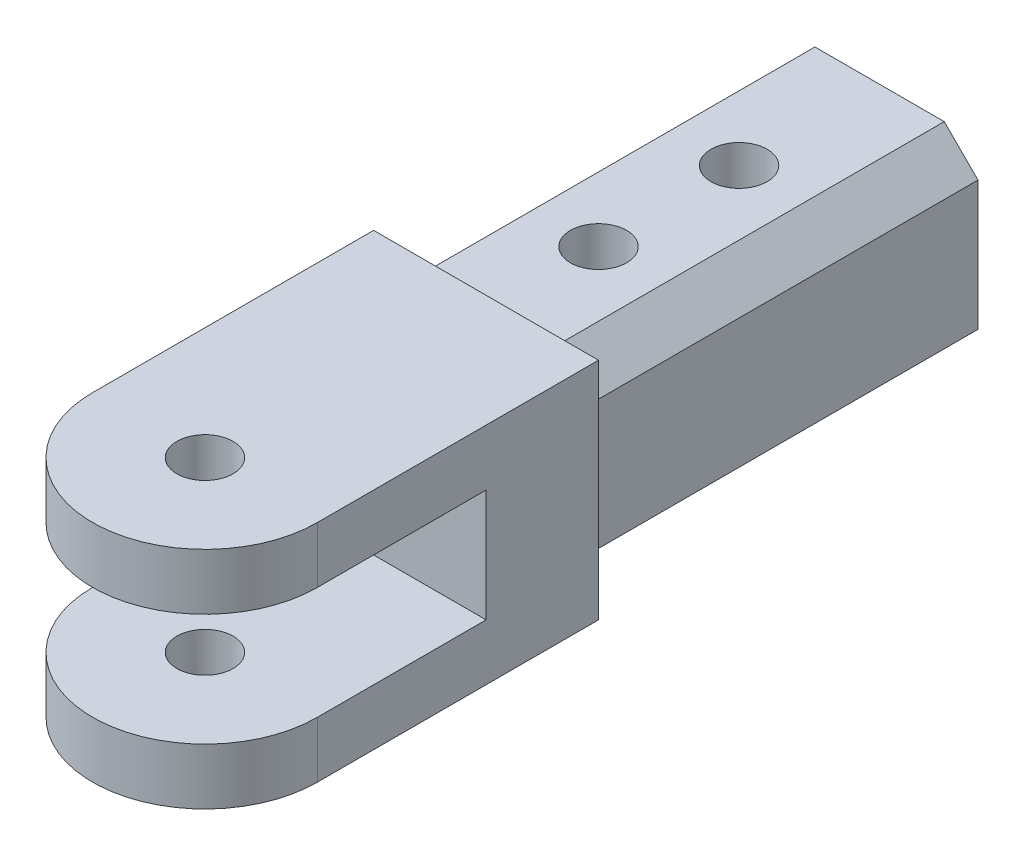
ISO-10303-21;
HEADER;
FILE_DESCRIPTION(('STEP AP214'),'2;1');
FILE_NAME('part.step','',(''),(''),'','','');
FILE_SCHEMA(('AUTOMOTIVE_DESIGN { 1 0 10303 214 1 1 1 1 }'));
ENDSEC;
DATA;
#1=APPLICATION_CONTEXT('core data for automotive mechanical design processes');
#2=APPLICATION_PROTOCOL_DEFINITION('international standard','automotive_design',2000,#1);
#3=PRODUCT_CONTEXT('',#1,'mechanical');
#4=PRODUCT('Part','Part','',(#3));
#5=PRODUCT_RELATED_PRODUCT_CATEGORY('part','',(#4));
#6=PRODUCT_DEFINITION_FORMATION('','',#4);
#7=PRODUCT_DEFINITION_CONTEXT('part definition',#1,'design');
#8=PRODUCT_DEFINITION('design','',#6,#7);
#9=PRODUCT_DEFINITION_SHAPE('','',#8);
#10=(LENGTH_UNIT() NAMED_UNIT(*) SI_UNIT(.MILLI.,.METRE.));
#11=(NAMED_UNIT(*) PLANE_ANGLE_UNIT() SI_UNIT($,.RADIAN.));
#12=(NAMED_UNIT(*) SI_UNIT($,.STERADIAN.) SOLID_ANGLE_UNIT());
#13=UNCERTAINTY_MEASURE_WITH_UNIT(LENGTH_MEASURE(1.E-05),#10,'distance_accuracy_value','');
#14=(GEOMETRIC_REPRESENTATION_CONTEXT(3) GLOBAL_UNCERTAINTY_ASSIGNED_CONTEXT((#13)) GLOBAL_UNIT_ASSIGNED_CONTEXT((#10,
#11,#12)) REPRESENTATION_CONTEXT('',''));
#15=CARTESIAN_POINT('',(0.,0.,0.));
#16=DIRECTION('',(0.,0.,1.));
#17=DIRECTION('',(1.,0.,0.));
#18=AXIS2_PLACEMENT_3D('',#15,#16,#17);
#19=CARTESIAN_POINT('',(-12.7,-12.7,88.9));
#20=DIRECTION('',(1.,0.,0.));
#21=DIRECTION('',(0.,0.,-1.));
#22=AXIS2_PLACEMENT_3D('',#19,#20,#21);
#23=PLANE('',#22);
#24=DIRECTION('',(0.,1.,0.));
#25=VECTOR('',#24,1.);
#26=CARTESIAN_POINT('',(-12.7,-12.7,76.2));
#27=LINE('',#26,#25);
#28=CARTESIAN_POINT('',(-12.7,6.35,76.2));
#29=VERTEX_POINT('',#28);
#30=CARTESIAN_POINT('',(-12.7,12.7,76.2));
#31=VERTEX_POINT('',#30);
#32=EDGE_CURVE('E160',#29,#31,#27,.T.);
#33=ORIENTED_EDGE('',*,*,#32,.T.);
#34=DIRECTION('',(0.,0.,-1.));
#35=VECTOR('',#34,1.);
#36=CARTESIAN_POINT('',(-12.7,12.7,88.9));
#37=LINE('',#36,#35);
#38=CARTESIAN_POINT('',(-12.7,12.7,44.45));
#39=VERTEX_POINT('',#38);
#40=EDGE_CURVE('E175',#31,#39,#37,.T.);
#41=ORIENTED_EDGE('',*,*,#40,.T.);
#42=DIRECTION('',(0.,-1.,0.));
#43=VECTOR('',#42,1.);
#44=CARTESIAN_POINT('',(-12.7,-12.7,44.45));
#45=LINE('',#44,#43);
#46=CARTESIAN_POINT('',(-12.7,-12.7,44.45));
#47=VERTEX_POINT('',#46);
#48=EDGE_CURVE('E173',#39,#47,#45,.T.);
#49=ORIENTED_EDGE('',*,*,#48,.T.);
#50=DIRECTION('',(0.,0.,-1.));
#51=VECTOR('',#50,1.);
#52=CARTESIAN_POINT('',(-12.7,-12.7,88.9));
#53=LINE('',#52,#51);
#54=CARTESIAN_POINT('',(-12.7,-12.7,76.2));
#55=VERTEX_POINT('',#54);
#56=EDGE_CURVE('E166',#55,#47,#53,.T.);
#57=ORIENTED_EDGE('',*,*,#56,.F.);
#58=CARTESIAN_POINT('',(-12.7,-6.35,76.2));
#59=VERTEX_POINT('',#58);
#60=EDGE_CURVE('E151',#55,#59,#27,.T.);
#61=ORIENTED_EDGE('',*,*,#60,.T.);
#62=DIRECTION('',(0.,0.,1.));
#63=VECTOR('',#62,1.);
#64=CARTESIAN_POINT('',(-12.7,-6.35,57.15));
#65=LINE('',#64,#63);
#66=CARTESIAN_POINT('',(-12.7,-6.35,57.15));
#67=VERTEX_POINT('',#66);
#68=EDGE_CURVE('E277',#67,#59,#65,.T.);
#69=ORIENTED_EDGE('',*,*,#68,.F.);
#70=DIRECTION('',(0.,-1.,0.));
#71=VECTOR('',#70,1.);
#72=CARTESIAN_POINT('',(-12.7,-6.35,57.15));
#73=LINE('',#72,#71);
#74=CARTESIAN_POINT('',(-12.7,6.35,57.15));
#75=VERTEX_POINT('',#74);
#76=EDGE_CURVE('E267',#75,#67,#73,.T.);
#77=ORIENTED_EDGE('',*,*,#76,.F.);
#78=DIRECTION('',(0.,0.,1.));
#79=VECTOR('',#78,1.);
#80=CARTESIAN_POINT('',(-12.7,6.35,57.15));
#81=LINE('',#80,#79);
#82=EDGE_CURVE('E279',#75,#29,#81,.T.);
#83=ORIENTED_EDGE('',*,*,#82,.T.);
#84=EDGE_LOOP('',(#33,#41,#49,#57,#61,#69,#77,#83));
#85=FACE_BOUND('',#84,.T.);
#86=ADVANCED_FACE('F39',(#85),#23,.F.);
#87=CARTESIAN_POINT('',(11.1125,-11.1125,44.45));
#88=DIRECTION('',(-1.,0.,0.));
#89=DIRECTION('',(0.,0.,1.));
#90=AXIS2_PLACEMENT_3D('',#87,#88,#89);
#91=PLANE('',#90);
#92=DIRECTION('',(0.,1.,0.));
#93=VECTOR('',#92,1.);
#94=CARTESIAN_POINT('',(11.1125,-11.1125,44.45));
#95=LINE('',#94,#93);
#96=CARTESIAN_POINT('',(11.1125,-7.30250000000001,44.45));
#97=VERTEX_POINT('',#96);
#98=CARTESIAN_POINT('',(11.1125,7.30249999999998,44.45));
#99=VERTEX_POINT('',#98);
#100=EDGE_CURVE('E185',#97,#99,#95,.T.);
#101=ORIENTED_EDGE('',*,*,#100,.F.);
#102=DIRECTION('',(0.,0.,-1.));
#103=VECTOR('',#102,1.);
#104=CARTESIAN_POINT('',(11.1125,-7.30250000000001,44.45));
#105=LINE('',#104,#103);
#106=CARTESIAN_POINT('',(11.1125,-7.30250000000001,0.));
#107=VERTEX_POINT('',#106);
#108=EDGE_CURVE('E209',#97,#107,#105,.T.);
#109=ORIENTED_EDGE('',*,*,#108,.T.);
#110=DIRECTION('',(0.,1.,0.));
#111=VECTOR('',#110,1.);
#112=CARTESIAN_POINT('',(11.1125,-11.1125,0.));
#113=LINE('',#112,#111);
#114=CARTESIAN_POINT('',(11.1125,7.30249999999998,0.));
#115=VERTEX_POINT('',#114);
#116=EDGE_CURVE('E184',#107,#115,#113,.T.);
#117=ORIENTED_EDGE('',*,*,#116,.T.);
#118=DIRECTION('',(0.,0.,1.));
#119=VECTOR('',#118,1.);
#120=CARTESIAN_POINT('',(11.1125,7.30249999999998,44.45));
#121=LINE('',#120,#119);
#122=EDGE_CURVE('E198',#115,#99,#121,.T.);
#123=ORIENTED_EDGE('',*,*,#122,.T.);
#124=EDGE_LOOP('',(#101,#109,#117,#123));
#125=FACE_BOUND('',#124,.T.);
#126=ADVANCED_FACE('F322',(#125),#91,.F.);
#127=CARTESIAN_POINT('',(-11.1125,11.1125,44.45));
#128=DIRECTION('',(0.,-1.,0.));
#129=DIRECTION('',(0.,0.,-1.));
#130=AXIS2_PLACEMENT_3D('',#127,#128,#129);
#131=PLANE('',#130);
#132=CARTESIAN_POINT('',(0.,11.1125,31.75));
#133=DIRECTION('',(0.,1.,0.));
#134=DIRECTION('',(0.,0.,1.));
#135=AXIS2_PLACEMENT_3D('',#132,#133,#134);
#136=CIRCLE('',#135,3.175);
#137=CARTESIAN_POINT('',(0.,11.1125,34.925));
#138=VERTEX_POINT('',#137);
#139=EDGE_CURVE('E307',#138,#138,#136,.T.);
#140=ORIENTED_EDGE('',*,*,#139,.F.);
#141=EDGE_LOOP('',(#140));
#142=FACE_BOUND('',#141,.T.);
#143=CARTESIAN_POINT('',(0.,11.1125,15.875));
#144=DIRECTION('',(0.,1.,0.));
#145=DIRECTION('',(0.,0.,1.));
#146=AXIS2_PLACEMENT_3D('',#143,#144,#145);
#147=CIRCLE('',#146,3.175);
#148=CARTESIAN_POINT('',(0.,11.1125,19.05));
#149=VERTEX_POINT('',#148);
#150=EDGE_CURVE('E308',#149,#149,#147,.T.);
#151=ORIENTED_EDGE('',*,*,#150,.F.);
#152=EDGE_LOOP('',(#151));
#153=FACE_BOUND('',#152,.T.);
#154=DIRECTION('',(-1.,0.,0.));
#155=VECTOR('',#154,1.);
#156=CARTESIAN_POINT('',(-11.1125,11.1125,0.));
#157=LINE('',#156,#155);
#158=CARTESIAN_POINT('',(7.30249999999999,11.1125,0.));
#159=VERTEX_POINT('',#158);
#160=CARTESIAN_POINT('',(-7.30249999999999,11.1125,0.));
#161=VERTEX_POINT('',#160);
#162=EDGE_CURVE('E201',#159,#161,#157,.T.);
#163=ORIENTED_EDGE('',*,*,#162,.T.);
#164=DIRECTION('',(0.,0.,1.));
#165=VECTOR('',#164,1.);
#166=CARTESIAN_POINT('',(-7.30249999999999,11.1125,44.45));
#167=LINE('',#166,#165);
#168=CARTESIAN_POINT('',(-7.30249999999999,11.1125,44.45));
#169=VERTEX_POINT('',#168);
#170=EDGE_CURVE('E47',#161,#169,#167,.T.);
#171=ORIENTED_EDGE('',*,*,#170,.T.);
#172=DIRECTION('',(-1.,0.,0.));
#173=VECTOR('',#172,1.);
#174=CARTESIAN_POINT('',(-11.1125,11.1125,44.45));
#175=LINE('',#174,#173);
#176=CARTESIAN_POINT('',(7.30249999999999,11.1125,44.45));
#177=VERTEX_POINT('',#176);
#178=EDGE_CURVE('E188',#177,#169,#175,.T.);
#179=ORIENTED_EDGE('',*,*,#178,.F.);
#180=DIRECTION('',(0.,0.,-1.));
#181=VECTOR('',#180,1.);
#182=CARTESIAN_POINT('',(7.30249999999999,11.1125,44.45));
#183=LINE('',#182,#181);
#184=EDGE_CURVE('E241',#177,#159,#183,.T.);
#185=ORIENTED_EDGE('',*,*,#184,.T.);
#186=EDGE_LOOP('',(#163,#171,#179,#185));
#187=FACE_BOUND('',#186,.T.);
#188=ADVANCED_FACE('F318',(#142,#153,#187),#131,.F.);
#189=CARTESIAN_POINT('',(-11.1125,-11.1125,44.45));
#190=DIRECTION('',(1.,0.,0.));
#191=DIRECTION('',(0.,0.,-1.));
#192=AXIS2_PLACEMENT_3D('',#189,#190,#191);
#193=PLANE('',#192);
#194=DIRECTION('',(0.,-1.,0.));
#195=VECTOR('',#194,1.);
#196=CARTESIAN_POINT('',(-11.1125,-11.1125,0.));
#197=LINE('',#196,#195);
#198=CARTESIAN_POINT('',(-11.1125,7.3025,0.));
#199=VERTEX_POINT('',#198);
#200=CARTESIAN_POINT('',(-11.1125,-7.30249999999999,0.));
#201=VERTEX_POINT('',#200);
#202=EDGE_CURVE('E204',#199,#201,#197,.T.);
#203=ORIENTED_EDGE('',*,*,#202,.T.);
#204=DIRECTION('',(0.,0.,1.));
#205=VECTOR('',#204,1.);
#206=CARTESIAN_POINT('',(-11.1125,-7.30249999999999,44.45));
#207=LINE('',#206,#205);
#208=CARTESIAN_POINT('',(-11.1125,-7.30249999999999,44.45));
#209=VERTEX_POINT('',#208);
#210=EDGE_CURVE('E62',#201,#209,#207,.T.);
#211=ORIENTED_EDGE('',*,*,#210,.T.);
#212=DIRECTION('',(0.,-1.,0.));
#213=VECTOR('',#212,1.);
#214=CARTESIAN_POINT('',(-11.1125,-11.1125,44.45));
#215=LINE('',#214,#213);
#216=CARTESIAN_POINT('',(-11.1125,7.3025,44.45));
#217=VERTEX_POINT('',#216);
#218=EDGE_CURVE('E192',#217,#209,#215,.T.);
#219=ORIENTED_EDGE('',*,*,#218,.F.);
#220=DIRECTION('',(0.,0.,-1.));
#221=VECTOR('',#220,1.);
#222=CARTESIAN_POINT('',(-11.1125,7.3025,44.45));
#223=LINE('',#222,#221);
#224=EDGE_CURVE('E237',#217,#199,#223,.T.);
#225=ORIENTED_EDGE('',*,*,#224,.T.);
#226=EDGE_LOOP('',(#203,#211,#219,#225));
#227=FACE_BOUND('',#226,.T.);
#228=ADVANCED_FACE('F321',(#227),#193,.F.);
#229=CARTESIAN_POINT('',(-11.1125,-11.1125,44.45));
#230=DIRECTION('',(0.,1.,0.));
#231=DIRECTION('',(0.,0.,1.));
#232=AXIS2_PLACEMENT_3D('',#229,#230,#231);
#233=PLANE('',#232);
#234=CARTESIAN_POINT('',(0.,-11.1125,31.75));
#235=DIRECTION('',(0.,1.,0.));
#236=DIRECTION('',(0.,0.,1.));
#237=AXIS2_PLACEMENT_3D('',#234,#235,#236);
#238=CIRCLE('',#237,3.175);
#239=CARTESIAN_POINT('',(0.,-11.1125,34.925));
#240=VERTEX_POINT('',#239);
#241=EDGE_CURVE('E302',#240,#240,#238,.F.);
#242=ORIENTED_EDGE('',*,*,#241,.F.);
#243=EDGE_LOOP('',(#242));
#244=FACE_BOUND('',#243,.T.);
#245=CARTESIAN_POINT('',(0.,-11.1125,15.875));
#246=DIRECTION('',(0.,1.,0.));
#247=DIRECTION('',(0.,0.,1.));
#248=AXIS2_PLACEMENT_3D('',#245,#246,#247);
#249=CIRCLE('',#248,3.175);
#250=CARTESIAN_POINT('',(0.,-11.1125,19.05));
#251=VERTEX_POINT('',#250);
#252=EDGE_CURVE('E304',#251,#251,#249,.F.);
#253=ORIENTED_EDGE('',*,*,#252,.F.);
#254=EDGE_LOOP('',(#253));
#255=FACE_BOUND('',#254,.T.);
#256=DIRECTION('',(1.,0.,0.));
#257=VECTOR('',#256,1.);
#258=CARTESIAN_POINT('',(-11.1125,-11.1125,0.));
#259=LINE('',#258,#257);
#260=CARTESIAN_POINT('',(-7.30250000000001,-11.1125,0.));
#261=VERTEX_POINT('',#260);
#262=CARTESIAN_POINT('',(7.30249999999999,-11.1125,0.));
#263=VERTEX_POINT('',#262);
#264=EDGE_CURVE('E189',#261,#263,#259,.T.);
#265=ORIENTED_EDGE('',*,*,#264,.T.);
#266=DIRECTION('',(0.,0.,1.));
#267=VECTOR('',#266,1.);
#268=CARTESIAN_POINT('',(7.30249999999999,-11.1125,44.45));
#269=LINE('',#268,#267);
#270=CARTESIAN_POINT('',(7.30249999999999,-11.1125,44.45));
#271=VERTEX_POINT('',#270);
#272=EDGE_CURVE('E223',#263,#271,#269,.T.);
#273=ORIENTED_EDGE('',*,*,#272,.T.);
#274=DIRECTION('',(1.,0.,0.));
#275=VECTOR('',#274,1.);
#276=CARTESIAN_POINT('',(-11.1125,-11.1125,44.45));
#277=LINE('',#276,#275);
#278=CARTESIAN_POINT('',(-7.30250000000001,-11.1125,44.45));
#279=VERTEX_POINT('',#278);
#280=EDGE_CURVE('E195',#279,#271,#277,.T.);
#281=ORIENTED_EDGE('',*,*,#280,.F.);
#282=DIRECTION('',(0.,0.,-1.));
#283=VECTOR('',#282,1.);
#284=CARTESIAN_POINT('',(-7.30250000000001,-11.1125,44.45));
#285=LINE('',#284,#283);
#286=EDGE_CURVE('E220',#279,#261,#285,.T.);
#287=ORIENTED_EDGE('',*,*,#286,.T.);
#288=EDGE_LOOP('',(#265,#273,#281,#287));
#289=FACE_BOUND('',#288,.T.);
#290=ADVANCED_FACE('F348',(#244,#255,#289),#233,.F.);
#291=CARTESIAN_POINT('',(0.,0.,0.));
#292=DIRECTION('',(0.,0.,-1.));
#293=DIRECTION('',(-1.,0.,0.));
#294=AXIS2_PLACEMENT_3D('',#291,#292,#293);
#295=PLANE('',#294);
#296=ORIENTED_EDGE('',*,*,#116,.F.);
#297=DIRECTION('',(0.707106781186549,0.707106781186546,0.));
#298=VECTOR('',#297,1.);
#299=CARTESIAN_POINT('',(9.20749999999998,-9.20750000000001,0.));
#300=LINE('',#299,#298);
#301=EDGE_CURVE('E218',#107,#263,#300,.F.);
#302=ORIENTED_EDGE('',*,*,#301,.T.);
#303=ORIENTED_EDGE('',*,*,#264,.F.);
#304=DIRECTION('',(0.707106781186546,-0.707106781186549,0.));
#305=VECTOR('',#304,1.);
#306=CARTESIAN_POINT('',(-9.20750000000002,-9.20749999999999,0.));
#307=LINE('',#306,#305);
#308=EDGE_CURVE('E216',#261,#201,#307,.F.);
#309=ORIENTED_EDGE('',*,*,#308,.T.);
#310=ORIENTED_EDGE('',*,*,#202,.F.);
#311=DIRECTION('',(-0.707106781186549,-0.707106781186546,0.));
#312=VECTOR('',#311,1.);
#313=CARTESIAN_POINT('',(-9.20749999999998,9.20750000000001,0.));
#314=LINE('',#313,#312);
#315=EDGE_CURVE('E214',#199,#161,#314,.F.);
#316=ORIENTED_EDGE('',*,*,#315,.T.);
#317=ORIENTED_EDGE('',*,*,#162,.F.);
#318=DIRECTION('',(-0.707106781186546,0.707106781186549,0.));
#319=VECTOR('',#318,1.);
#320=CARTESIAN_POINT('',(9.20750000000001,9.20749999999998,0.));
#321=LINE('',#320,#319);
#322=EDGE_CURVE('E212',#159,#115,#321,.F.);
#323=ORIENTED_EDGE('',*,*,#322,.T.);
#324=EDGE_LOOP('',(#296,#302,#303,#309,#310,#316,#317,#323));
#325=FACE_BOUND('',#324,.T.);
#326=ADVANCED_FACE('F339',(#325),#295,.T.);
#327=CARTESIAN_POINT('',(11.1125,-7.30250000000001,44.45));
#328=DIRECTION('',(-0.707106781186546,0.707106781186549,0.));
#329=DIRECTION('',(0.,0.,-1.));
#330=AXIS2_PLACEMENT_3D('',#327,#328,#329);
#331=PLANE('',#330);
#332=DIRECTION('',(-0.707106781186549,-0.707106781186546,0.));
#333=VECTOR('',#332,1.);
#334=CARTESIAN_POINT('',(11.1125,-7.30250000000001,44.45));
#335=LINE('',#334,#333);
#336=EDGE_CURVE('E234',#271,#97,#335,.F.);
#337=ORIENTED_EDGE('',*,*,#336,.F.);
#338=ORIENTED_EDGE('',*,*,#272,.F.);
#339=ORIENTED_EDGE('',*,*,#301,.F.);
#340=ORIENTED_EDGE('',*,*,#108,.F.);
#341=EDGE_LOOP('',(#337,#338,#339,#340));
#342=FACE_BOUND('',#341,.T.);
#343=ADVANCED_FACE('F344',(#342),#331,.F.);
#344=CARTESIAN_POINT('',(-7.30250000000001,-11.1125,44.45));
#345=DIRECTION('',(0.707106781186549,0.707106781186546,0.));
#346=DIRECTION('',(0.,0.,-1.));
#347=AXIS2_PLACEMENT_3D('',#344,#345,#346);
#348=PLANE('',#347);
#349=DIRECTION('',(-0.707106781186546,0.707106781186549,0.));
#350=VECTOR('',#349,1.);
#351=CARTESIAN_POINT('',(-7.30250000000001,-11.1125,44.45));
#352=LINE('',#351,#350);
#353=EDGE_CURVE('E231',#209,#279,#352,.F.);
#354=ORIENTED_EDGE('',*,*,#353,.F.);
#355=ORIENTED_EDGE('',*,*,#210,.F.);
#356=ORIENTED_EDGE('',*,*,#308,.F.);
#357=ORIENTED_EDGE('',*,*,#286,.F.);
#358=EDGE_LOOP('',(#354,#355,#356,#357));
#359=FACE_BOUND('',#358,.T.);
#360=ADVANCED_FACE('F351',(#359),#348,.F.);
#361=CARTESIAN_POINT('',(-11.1125,7.3025,44.45));
#362=DIRECTION('',(0.707106781186546,-0.707106781186549,0.));
#363=DIRECTION('',(0.,0.,-1.));
#364=AXIS2_PLACEMENT_3D('',#361,#362,#363);
#365=PLANE('',#364);
#366=DIRECTION('',(0.707106781186549,0.707106781186546,0.));
#367=VECTOR('',#366,1.);
#368=CARTESIAN_POINT('',(-11.1125,7.3025,44.45));
#369=LINE('',#368,#367);
#370=EDGE_CURVE('E228',#169,#217,#369,.F.);
#371=ORIENTED_EDGE('',*,*,#370,.F.);
#372=ORIENTED_EDGE('',*,*,#170,.F.);
#373=ORIENTED_EDGE('',*,*,#315,.F.);
#374=ORIENTED_EDGE('',*,*,#224,.F.);
#375=EDGE_LOOP('',(#371,#372,#373,#374));
#376=FACE_BOUND('',#375,.T.);
#377=ADVANCED_FACE('F332',(#376),#365,.F.);
#378=CARTESIAN_POINT('',(7.30249999999999,11.1125,44.45));
#379=DIRECTION('',(-0.707106781186549,-0.707106781186546,0.));
#380=DIRECTION('',(0.,0.,-1.));
#381=AXIS2_PLACEMENT_3D('',#378,#379,#380);
#382=PLANE('',#381);
#383=DIRECTION('',(0.707106781186546,-0.707106781186549,0.));
#384=VECTOR('',#383,1.);
#385=CARTESIAN_POINT('',(7.30249999999999,11.1125,44.45));
#386=LINE('',#385,#384);
#387=EDGE_CURVE('E225',#99,#177,#386,.F.);
#388=ORIENTED_EDGE('',*,*,#387,.F.);
#389=ORIENTED_EDGE('',*,*,#122,.F.);
#390=ORIENTED_EDGE('',*,*,#322,.F.);
#391=ORIENTED_EDGE('',*,*,#184,.F.);
#392=EDGE_LOOP('',(#388,#389,#390,#391));
#393=FACE_BOUND('',#392,.T.);
#394=ADVANCED_FACE('F41',(#393),#382,.F.);
#395=CARTESIAN_POINT('',(12.7,-12.7,88.9));
#396=DIRECTION('',(-1.,0.,0.));
#397=DIRECTION('',(0.,0.,1.));
#398=AXIS2_PLACEMENT_3D('',#395,#396,#397);
#399=PLANE('',#398);
#400=DIRECTION('',(0.,0.,-1.));
#401=VECTOR('',#400,1.);
#402=CARTESIAN_POINT('',(12.7,12.7,88.9));
#403=LINE('',#402,#401);
#404=CARTESIAN_POINT('',(12.7,12.7,76.2));
#405=VERTEX_POINT('',#404);
#406=CARTESIAN_POINT('',(12.7,12.7,44.45));
#407=VERTEX_POINT('',#406);
#408=EDGE_CURVE('E177',#405,#407,#403,.T.);
#409=ORIENTED_EDGE('',*,*,#408,.F.);
#410=DIRECTION('',(0.,1.,0.));
#411=VECTOR('',#410,1.);
#412=CARTESIAN_POINT('',(12.7,-12.7,76.2));
#413=LINE('',#412,#411);
#414=CARTESIAN_POINT('',(12.7,6.35,76.2));
#415=VERTEX_POINT('',#414);
#416=EDGE_CURVE('E159',#415,#405,#413,.T.);
#417=ORIENTED_EDGE('',*,*,#416,.F.);
#418=DIRECTION('',(0.,0.,1.));
#419=VECTOR('',#418,1.);
#420=CARTESIAN_POINT('',(12.7,6.35,57.15));
#421=LINE('',#420,#419);
#422=CARTESIAN_POINT('',(12.7,6.35,57.15));
#423=VERTEX_POINT('',#422);
#424=EDGE_CURVE('E272',#423,#415,#421,.T.);
#425=ORIENTED_EDGE('',*,*,#424,.F.);
#426=DIRECTION('',(0.,1.,0.));
#427=VECTOR('',#426,1.);
#428=CARTESIAN_POINT('',(12.7,-6.35,57.15));
#429=LINE('',#428,#427);
#430=CARTESIAN_POINT('',(12.7,-6.35,57.15));
#431=VERTEX_POINT('',#430);
#432=EDGE_CURVE('E251',#431,#423,#429,.T.);
#433=ORIENTED_EDGE('',*,*,#432,.F.);
#434=DIRECTION('',(0.,0.,1.));
#435=VECTOR('',#434,1.);
#436=CARTESIAN_POINT('',(12.7,-6.35,57.15));
#437=LINE('',#436,#435);
#438=CARTESIAN_POINT('',(12.7,-6.35,76.2));
#439=VERTEX_POINT('',#438);
#440=EDGE_CURVE('E273',#431,#439,#437,.T.);
#441=ORIENTED_EDGE('',*,*,#440,.T.);
#442=CARTESIAN_POINT('',(12.7,-12.7,76.2));
#443=VERTEX_POINT('',#442);
#444=EDGE_CURVE('E297',#443,#439,#413,.T.);
#445=ORIENTED_EDGE('',*,*,#444,.F.);
#446=DIRECTION('',(0.,0.,-1.));
#447=VECTOR('',#446,1.);
#448=CARTESIAN_POINT('',(12.7,-12.7,88.9));
#449=LINE('',#448,#447);
#450=CARTESIAN_POINT('',(12.7,-12.7,44.45));
#451=VERTEX_POINT('',#450);
#452=EDGE_CURVE('E168',#443,#451,#449,.T.);
#453=ORIENTED_EDGE('',*,*,#452,.T.);
#454=DIRECTION('',(0.,1.,0.));
#455=VECTOR('',#454,1.);
#456=CARTESIAN_POINT('',(12.7,-12.7,44.45));
#457=LINE('',#456,#455);
#458=EDGE_CURVE('E276',#451,#407,#457,.T.);
#459=ORIENTED_EDGE('',*,*,#458,.T.);
#460=EDGE_LOOP('',(#409,#417,#425,#433,#441,#445,#453,#459));
#461=FACE_BOUND('',#460,.T.);
#462=ADVANCED_FACE('F295',(#461),#399,.F.);
#463=CARTESIAN_POINT('',(-12.7,12.7,88.9));
#464=DIRECTION('',(0.,-1.,0.));
#465=DIRECTION('',(0.,0.,-1.));
#466=AXIS2_PLACEMENT_3D('',#463,#464,#465);
#467=PLANE('',#466);
#468=CARTESIAN_POINT('',(0.,12.7,76.2));
#469=DIRECTION('',(0.,1.,0.));
#470=DIRECTION('',(0.,0.,1.));
#471=AXIS2_PLACEMENT_3D('',#468,#469,#470);
#472=CIRCLE('',#471,3.175);
#473=CARTESIAN_POINT('',(0.,12.7,79.375));
#474=VERTEX_POINT('',#473);
#475=EDGE_CURVE('E254',#474,#474,#472,.T.);
#476=ORIENTED_EDGE('',*,*,#475,.F.);
#477=EDGE_LOOP('',(#476));
#478=FACE_BOUND('',#477,.T.);
#479=ORIENTED_EDGE('',*,*,#40,.F.);
#480=CARTESIAN_POINT('',(0.,12.7,76.2));
#481=DIRECTION('',(0.,-1.,0.));
#482=DIRECTION('',(0.,0.,1.));
#483=AXIS2_PLACEMENT_3D('',#480,#481,#482);
#484=CIRCLE('',#483,12.7);
#485=EDGE_CURVE('E169',#405,#31,#484,.T.);
#486=ORIENTED_EDGE('',*,*,#485,.F.);
#487=ORIENTED_EDGE('',*,*,#408,.T.);
#488=DIRECTION('',(-1.,0.,0.));
#489=VECTOR('',#488,1.);
#490=CARTESIAN_POINT('',(-12.7,12.7,44.45));
#491=LINE('',#490,#489);
#492=EDGE_CURVE('E286',#407,#39,#491,.T.);
#493=ORIENTED_EDGE('',*,*,#492,.T.);
#494=EDGE_LOOP('',(#479,#486,#487,#493));
#495=FACE_BOUND('',#494,.T.);
#496=ADVANCED_FACE('F372',(#478,#495),#467,.F.);
#497=CARTESIAN_POINT('',(-12.7,-12.7,88.9));
#498=DIRECTION('',(0.,1.,0.));
#499=DIRECTION('',(0.,0.,1.));
#500=AXIS2_PLACEMENT_3D('',#497,#498,#499);
#501=PLANE('',#500);
#502=CARTESIAN_POINT('',(0.,-12.7,76.2));
#503=DIRECTION('',(0.,1.,0.));
#504=DIRECTION('',(0.,0.,1.));
#505=AXIS2_PLACEMENT_3D('',#502,#503,#504);
#506=CIRCLE('',#505,3.175);
#507=CARTESIAN_POINT('',(0.,-12.7,79.375));
#508=VERTEX_POINT('',#507);
#509=EDGE_CURVE('E247',#508,#508,#506,.T.);
#510=ORIENTED_EDGE('',*,*,#509,.T.);
#511=EDGE_LOOP('',(#510));
#512=FACE_BOUND('',#511,.T.);
#513=ORIENTED_EDGE('',*,*,#452,.F.);
#514=CARTESIAN_POINT('',(0.,-12.7,76.2));
#515=DIRECTION('',(0.,-1.,0.));
#516=DIRECTION('',(0.,0.,1.));
#517=AXIS2_PLACEMENT_3D('',#514,#515,#516);
#518=CIRCLE('',#517,12.7);
#519=EDGE_CURVE('E154',#443,#55,#518,.T.);
#520=ORIENTED_EDGE('',*,*,#519,.T.);
#521=ORIENTED_EDGE('',*,*,#56,.T.);
#522=DIRECTION('',(1.,0.,0.));
#523=VECTOR('',#522,1.);
#524=CARTESIAN_POINT('',(-12.7,-12.7,44.45));
#525=LINE('',#524,#523);
#526=EDGE_CURVE('E179',#47,#451,#525,.T.);
#527=ORIENTED_EDGE('',*,*,#526,.T.);
#528=EDGE_LOOP('',(#513,#520,#521,#527));
#529=FACE_BOUND('',#528,.T.);
#530=ADVANCED_FACE('F164',(#512,#529),#501,.F.);
#531=CARTESIAN_POINT('',(0.,0.,44.45));
#532=DIRECTION('',(0.,0.,-1.));
#533=DIRECTION('',(-1.,0.,0.));
#534=AXIS2_PLACEMENT_3D('',#531,#532,#533);
#535=PLANE('',#534);
#536=ORIENTED_EDGE('',*,*,#218,.T.);
#537=ORIENTED_EDGE('',*,*,#353,.T.);
#538=ORIENTED_EDGE('',*,*,#280,.T.);
#539=ORIENTED_EDGE('',*,*,#336,.T.);
#540=ORIENTED_EDGE('',*,*,#100,.T.);
#541=ORIENTED_EDGE('',*,*,#387,.T.);
#542=ORIENTED_EDGE('',*,*,#178,.T.);
#543=ORIENTED_EDGE('',*,*,#370,.T.);
#544=EDGE_LOOP('',(#536,#537,#538,#539,#540,#541,#542,#543));
#545=FACE_BOUND('',#544,.T.);
#546=ORIENTED_EDGE('',*,*,#458,.F.);
#547=ORIENTED_EDGE('',*,*,#526,.F.);
#548=ORIENTED_EDGE('',*,*,#48,.F.);
#549=ORIENTED_EDGE('',*,*,#492,.F.);
#550=EDGE_LOOP('',(#546,#547,#548,#549));
#551=FACE_BOUND('',#550,.T.);
#552=ADVANCED_FACE('F292',(#545,#551),#535,.T.);
#553=CARTESIAN_POINT('',(-12.7,-6.35,57.15));
#554=DIRECTION('',(0.,-1.,0.));
#555=DIRECTION('',(0.,0.,-1.));
#556=AXIS2_PLACEMENT_3D('',#553,#554,#555);
#557=PLANE('',#556);
#558=CARTESIAN_POINT('',(0.,-6.35,76.2));
#559=DIRECTION('',(0.,-1.,0.));
#560=DIRECTION('',(0.,0.,-1.));
#561=AXIS2_PLACEMENT_3D('',#558,#559,#560);
#562=CIRCLE('',#561,3.175);
#563=CARTESIAN_POINT('',(0.,-6.35,73.025));
#564=VERTEX_POINT('',#563);
#565=EDGE_CURVE('E246',#564,#564,#562,.T.);
#566=ORIENTED_EDGE('',*,*,#565,.T.);
#567=EDGE_LOOP('',(#566));
#568=FACE_BOUND('',#567,.T.);
#569=ORIENTED_EDGE('',*,*,#68,.T.);
#570=CARTESIAN_POINT('',(0.,-6.35,76.2));
#571=DIRECTION('',(0.,-1.,0.));
#572=DIRECTION('',(0.,0.,-1.));
#573=AXIS2_PLACEMENT_3D('',#570,#571,#572);
#574=CIRCLE('',#573,12.7);
#575=EDGE_CURVE('E54',#59,#439,#574,.F.);
#576=ORIENTED_EDGE('',*,*,#575,.T.);
#577=ORIENTED_EDGE('',*,*,#440,.F.);
#578=DIRECTION('',(1.,0.,0.));
#579=VECTOR('',#578,1.);
#580=CARTESIAN_POINT('',(-12.7,-6.35,57.15));
#581=LINE('',#580,#579);
#582=EDGE_CURVE('E269',#67,#431,#581,.T.);
#583=ORIENTED_EDGE('',*,*,#582,.F.);
#584=EDGE_LOOP('',(#569,#576,#577,#583));
#585=FACE_BOUND('',#584,.T.);
#586=ADVANCED_FACE('F397',(#568,#585),#557,.F.);
#587=CARTESIAN_POINT('',(-12.7,6.35,57.15));
#588=DIRECTION('',(0.,1.,0.));
#589=DIRECTION('',(0.,0.,1.));
#590=AXIS2_PLACEMENT_3D('',#587,#588,#589);
#591=PLANE('',#590);
#592=CARTESIAN_POINT('',(0.,6.35,76.2));
#593=DIRECTION('',(0.,1.,0.));
#594=DIRECTION('',(0.,0.,1.));
#595=AXIS2_PLACEMENT_3D('',#592,#593,#594);
#596=CIRCLE('',#595,3.175);
#597=CARTESIAN_POINT('',(0.,6.35,79.375));
#598=VERTEX_POINT('',#597);
#599=EDGE_CURVE('E244',#598,#598,#596,.T.);
#600=ORIENTED_EDGE('',*,*,#599,.T.);
#601=EDGE_LOOP('',(#600));
#602=FACE_BOUND('',#601,.T.);
#603=CARTESIAN_POINT('',(0.,6.35,76.2));
#604=DIRECTION('',(0.,1.,0.));
#605=DIRECTION('',(0.,0.,1.));
#606=AXIS2_PLACEMENT_3D('',#603,#604,#605);
#607=CIRCLE('',#606,12.7);
#608=EDGE_CURVE('E11',#415,#29,#607,.F.);
#609=ORIENTED_EDGE('',*,*,#608,.T.);
#610=ORIENTED_EDGE('',*,*,#82,.F.);
#611=DIRECTION('',(-1.,0.,0.));
#612=VECTOR('',#611,1.);
#613=CARTESIAN_POINT('',(-12.7,6.35,57.15));
#614=LINE('',#613,#612);
#615=EDGE_CURVE('E264',#423,#75,#614,.T.);
#616=ORIENTED_EDGE('',*,*,#615,.F.);
#617=ORIENTED_EDGE('',*,*,#424,.T.);
#618=EDGE_LOOP('',(#609,#610,#616,#617));
#619=FACE_BOUND('',#618,.T.);
#620=ADVANCED_FACE('F406',(#602,#619),#591,.F.);
#621=CARTESIAN_POINT('',(0.,0.,57.15));
#622=DIRECTION('',(0.,0.,-1.));
#623=DIRECTION('',(-1.,0.,0.));
#624=AXIS2_PLACEMENT_3D('',#621,#622,#623);
#625=PLANE('',#624);
#626=ORIENTED_EDGE('',*,*,#432,.T.);
#627=ORIENTED_EDGE('',*,*,#615,.T.);
#628=ORIENTED_EDGE('',*,*,#76,.T.);
#629=ORIENTED_EDGE('',*,*,#582,.T.);
#630=EDGE_LOOP('',(#626,#627,#628,#629));
#631=FACE_BOUND('',#630,.T.);
#632=ADVANCED_FACE('F402',(#631),#625,.F.);
#633=CARTESIAN_POINT('',(0.,-12.7,76.2));
#634=DIRECTION('',(0.,1.,0.));
#635=DIRECTION('',(0.,0.,1.));
#636=AXIS2_PLACEMENT_3D('',#633,#634,#635);
#637=CYLINDRICAL_SURFACE('',#636,3.175);
#638=ORIENTED_EDGE('',*,*,#475,.T.);
#639=EDGE_LOOP('',(#638));
#640=FACE_BOUND('',#639,.T.);
#641=ORIENTED_EDGE('',*,*,#599,.F.);
#642=EDGE_LOOP('',(#641));
#643=FACE_BOUND('',#642,.T.);
#644=ADVANCED_FACE('F405',(#640,#643),#637,.F.);
#645=ORIENTED_EDGE('',*,*,#509,.F.);
#646=EDGE_LOOP('',(#645));
#647=FACE_BOUND('',#646,.T.);
#648=ORIENTED_EDGE('',*,*,#565,.F.);
#649=EDGE_LOOP('',(#648));
#650=FACE_BOUND('',#649,.T.);
#651=ADVANCED_FACE('F422',(#647,#650),#637,.F.);
#652=CARTESIAN_POINT('',(0.,-12.7,76.2));
#653=DIRECTION('',(0.,1.,0.));
#654=DIRECTION('',(0.,0.,1.));
#655=AXIS2_PLACEMENT_3D('',#652,#653,#654);
#656=CYLINDRICAL_SURFACE('',#655,12.7);
#657=ORIENTED_EDGE('',*,*,#485,.T.);
#658=ORIENTED_EDGE('',*,*,#32,.F.);
#659=ORIENTED_EDGE('',*,*,#608,.F.);
#660=ORIENTED_EDGE('',*,*,#416,.T.);
#661=EDGE_LOOP('',(#657,#658,#659,#660));
#662=FACE_BOUND('',#661,.T.);
#663=ADVANCED_FACE('F430',(#662),#656,.T.);
#664=ORIENTED_EDGE('',*,*,#575,.F.);
#665=ORIENTED_EDGE('',*,*,#60,.F.);
#666=ORIENTED_EDGE('',*,*,#519,.F.);
#667=ORIENTED_EDGE('',*,*,#444,.T.);
#668=EDGE_LOOP('',(#664,#665,#666,#667));
#669=FACE_BOUND('',#668,.T.);
#670=ADVANCED_FACE('F153',(#669),#656,.T.);
#671=CARTESIAN_POINT('',(0.,-20.0927561210692,15.875));
#672=DIRECTION('',(0.,1.,0.));
#673=DIRECTION('',(0.,0.,1.));
#674=AXIS2_PLACEMENT_3D('',#671,#672,#673);
#675=CYLINDRICAL_SURFACE('',#674,3.175);
#676=CARTESIAN_POINT('',(0.,-11.1125,19.05));
#677=CARTESIAN_POINT('',(0.,-10.8809895833333,19.05));
#678=CARTESIAN_POINT('',(0.,-10.6494791666667,19.05));
#679=CARTESIAN_POINT('',(0.,-10.1864583333333,19.05));
#680=CARTESIAN_POINT('',(0.,-9.95494791666667,19.05));
#681=CARTESIAN_POINT('',(0.,-9.49192708333334,19.05));
#682=CARTESIAN_POINT('',(0.,-9.26041666666667,19.05));
#683=CARTESIAN_POINT('',(0.,-8.79739583333334,19.05));
#684=CARTESIAN_POINT('',(0.,-8.56588541666667,19.05));
#685=CARTESIAN_POINT('',(0.,-8.10286458333334,19.05));
#686=CARTESIAN_POINT('',(0.,-7.87135416666667,19.05));
#687=CARTESIAN_POINT('',(0.,-7.40833333333333,19.05));
#688=CARTESIAN_POINT('',(0.,-7.17682291666667,19.05));
#689=CARTESIAN_POINT('',(0.,-6.71380208333334,19.05));
#690=CARTESIAN_POINT('',(0.,-6.48229166666667,19.05));
#691=CARTESIAN_POINT('',(0.,-6.01927083333334,19.05));
#692=CARTESIAN_POINT('',(0.,-5.78776041666667,19.05));
#693=CARTESIAN_POINT('',(0.,-5.32473958333334,19.05));
#694=CARTESIAN_POINT('',(0.,-5.09322916666667,19.05));
#695=CARTESIAN_POINT('',(0.,-4.63020833333334,19.05));
#696=CARTESIAN_POINT('',(0.,-4.39869791666667,19.05));
#697=CARTESIAN_POINT('',(0.,-3.93567708333334,19.05));
#698=CARTESIAN_POINT('',(0.,-3.70416666666667,19.05));
#699=CARTESIAN_POINT('',(0.,-3.24114583333334,19.05));
#700=CARTESIAN_POINT('',(0.,-3.00963541666667,19.05));
#701=CARTESIAN_POINT('',(0.,-2.54661458333334,19.05));
#702=CARTESIAN_POINT('',(0.,-2.31510416666667,19.05));
#703=CARTESIAN_POINT('',(0.,-1.85208333333334,19.05));
#704=CARTESIAN_POINT('',(0.,-1.62057291666667,19.05));
#705=CARTESIAN_POINT('',(0.,-1.15755208333334,19.05));
#706=CARTESIAN_POINT('',(0.,-0.926041666666671,19.05));
#707=CARTESIAN_POINT('',(0.,-0.463020833333338,19.05));
#708=CARTESIAN_POINT('',(0.,-0.231510416666671,19.05));
#709=CARTESIAN_POINT('',(0.,0.231510416666664,19.05));
#710=CARTESIAN_POINT('',(0.,0.463020833333331,19.05));
#711=CARTESIAN_POINT('',(0.,0.926041666666664,19.05));
#712=CARTESIAN_POINT('',(0.,1.15755208333333,19.05));
#713=CARTESIAN_POINT('',(0.,1.62057291666666,19.05));
#714=CARTESIAN_POINT('',(0.,1.85208333333333,19.05));
#715=CARTESIAN_POINT('',(0.,2.31510416666666,19.05));
#716=CARTESIAN_POINT('',(0.,2.54661458333333,19.05));
#717=CARTESIAN_POINT('',(0.,3.00963541666666,19.05));
#718=CARTESIAN_POINT('',(0.,3.24114583333333,19.05));
#719=CARTESIAN_POINT('',(0.,3.70416666666666,19.05));
#720=CARTESIAN_POINT('',(0.,3.93567708333333,19.05));
#721=CARTESIAN_POINT('',(0.,4.39869791666666,19.05));
#722=CARTESIAN_POINT('',(0.,4.63020833333333,19.05));
#723=CARTESIAN_POINT('',(0.,5.09322916666666,19.05));
#724=CARTESIAN_POINT('',(0.,5.32473958333333,19.05));
#725=CARTESIAN_POINT('',(0.,5.78776041666667,19.05));
#726=CARTESIAN_POINT('',(0.,6.01927083333333,19.05));
#727=CARTESIAN_POINT('',(0.,6.48229166666666,19.05));
#728=CARTESIAN_POINT('',(0.,6.71380208333333,19.05));
#729=CARTESIAN_POINT('',(0.,7.17682291666666,19.05));
#730=CARTESIAN_POINT('',(0.,7.40833333333333,19.05));
#731=CARTESIAN_POINT('',(0.,7.87135416666666,19.05));
#732=CARTESIAN_POINT('',(0.,8.10286458333333,19.05));
#733=CARTESIAN_POINT('',(0.,8.56588541666666,19.05));
#734=CARTESIAN_POINT('',(0.,8.79739583333333,19.05));
#735=CARTESIAN_POINT('',(0.,9.26041666666666,19.05));
#736=CARTESIAN_POINT('',(0.,9.49192708333333,19.05));
#737=CARTESIAN_POINT('',(0.,9.95494791666666,19.05));
#738=CARTESIAN_POINT('',(0.,10.1864583333333,19.05));
#739=CARTESIAN_POINT('',(0.,10.6494791666667,19.05));
#740=CARTESIAN_POINT('',(0.,10.8809895833333,19.05));
#741=CARTESIAN_POINT('',(0.,11.1125,19.05));
#742=B_SPLINE_CURVE_WITH_KNOTS('',3,(#676,#677,#678,#679,#680,#681,#682,#683,#684,#685,#686,
#687,#688,#689,#690,#691,#692,#693,#694,#695,#696,#697,#698,#699,#700,#701,#702,#703,#704,#705,
#706,#707,#708,#709,#710,#711,#712,#713,#714,#715,#716,#717,#718,#719,#720,#721,#722,#723,#724,
#725,#726,#727,#728,#729,#730,#731,#732,#733,#734,#735,#736,#737,#738,#739,#740,#741),
.UNSPECIFIED.,.F.,.F.,(4,2,2,2,2,2,2,2,2,2,2,2,2,2,2,2,2,2,2,2,2,2,2,2,2,2,2,2,2,2,2,2,4),(0.,
0.69453125,1.3890625,2.08359375,2.778125,3.47265625,4.1671875,4.86171875,5.55625,6.25078125,
6.9453125,7.63984375,8.334375,9.02890625,9.7234375,10.41796875,11.1125,11.80703125,12.5015625,
13.19609375,13.890625,14.58515625,15.2796875,15.97421875,16.66875,17.36328125,18.0578125,
18.75234375,19.446875,20.14140625,20.8359375,21.53046875,22.225),.UNSPECIFIED.);
#743=EDGE_CURVE('BSEAM444',#251,#149,#742,.T.);
#744=ORIENTED_EDGE('',*,*,#252,.T.);
#745=ORIENTED_EDGE('',*,*,#150,.T.);
#746=ORIENTED_EDGE('',*,*,#743,.T.);
#747=ORIENTED_EDGE('',*,*,#743,.F.);
#748=EDGE_LOOP('',(#744,#746,#745,#747));
#749=FACE_BOUND('',#748,.T.);
#750=ADVANCED_FACE('F444',(#749),#675,.F.);
#751=CARTESIAN_POINT('',(0.,-20.0927561210692,31.75));
#752=DIRECTION('',(0.,1.,0.));
#753=DIRECTION('',(0.,0.,1.));
#754=AXIS2_PLACEMENT_3D('',#751,#752,#753);
#755=CYLINDRICAL_SURFACE('',#754,3.175);
#756=CARTESIAN_POINT('',(0.,-11.1125,34.925));
#757=CARTESIAN_POINT('',(0.,-10.8809895833333,34.925));
#758=CARTESIAN_POINT('',(0.,-10.6494791666667,34.925));
#759=CARTESIAN_POINT('',(0.,-10.1864583333333,34.925));
#760=CARTESIAN_POINT('',(0.,-9.95494791666667,34.925));
#761=CARTESIAN_POINT('',(0.,-9.49192708333334,34.925));
#762=CARTESIAN_POINT('',(0.,-9.26041666666667,34.925));
#763=CARTESIAN_POINT('',(0.,-8.79739583333334,34.925));
#764=CARTESIAN_POINT('',(0.,-8.56588541666667,34.925));
#765=CARTESIAN_POINT('',(0.,-8.10286458333334,34.925));
#766=CARTESIAN_POINT('',(0.,-7.87135416666667,34.925));
#767=CARTESIAN_POINT('',(0.,-7.40833333333333,34.925));
#768=CARTESIAN_POINT('',(0.,-7.17682291666667,34.925));
#769=CARTESIAN_POINT('',(0.,-6.71380208333334,34.925));
#770=CARTESIAN_POINT('',(0.,-6.48229166666667,34.925));
#771=CARTESIAN_POINT('',(0.,-6.01927083333334,34.925));
#772=CARTESIAN_POINT('',(0.,-5.78776041666667,34.925));
#773=CARTESIAN_POINT('',(0.,-5.32473958333334,34.925));
#774=CARTESIAN_POINT('',(0.,-5.09322916666667,34.925));
#775=CARTESIAN_POINT('',(0.,-4.63020833333334,34.925));
#776=CARTESIAN_POINT('',(0.,-4.39869791666667,34.925));
#777=CARTESIAN_POINT('',(0.,-3.93567708333334,34.925));
#778=CARTESIAN_POINT('',(0.,-3.70416666666667,34.925));
#779=CARTESIAN_POINT('',(0.,-3.24114583333334,34.925));
#780=CARTESIAN_POINT('',(0.,-3.00963541666667,34.925));
#781=CARTESIAN_POINT('',(0.,-2.54661458333334,34.925));
#782=CARTESIAN_POINT('',(0.,-2.31510416666667,34.925));
#783=CARTESIAN_POINT('',(0.,-1.85208333333334,34.925));
#784=CARTESIAN_POINT('',(0.,-1.62057291666667,34.925));
#785=CARTESIAN_POINT('',(0.,-1.15755208333334,34.925));
#786=CARTESIAN_POINT('',(0.,-0.926041666666671,34.925));
#787=CARTESIAN_POINT('',(0.,-0.463020833333338,34.925));
#788=CARTESIAN_POINT('',(0.,-0.231510416666671,34.925));
#789=CARTESIAN_POINT('',(0.,0.231510416666664,34.925));
#790=CARTESIAN_POINT('',(0.,0.463020833333331,34.925));
#791=CARTESIAN_POINT('',(0.,0.926041666666664,34.925));
#792=CARTESIAN_POINT('',(0.,1.15755208333333,34.925));
#793=CARTESIAN_POINT('',(0.,1.62057291666666,34.925));
#794=CARTESIAN_POINT('',(0.,1.85208333333333,34.925));
#795=CARTESIAN_POINT('',(0.,2.31510416666666,34.925));
#796=CARTESIAN_POINT('',(0.,2.54661458333333,34.925));
#797=CARTESIAN_POINT('',(0.,3.00963541666666,34.925));
#798=CARTESIAN_POINT('',(0.,3.24114583333333,34.925));
#799=CARTESIAN_POINT('',(0.,3.70416666666666,34.925));
#800=CARTESIAN_POINT('',(0.,3.93567708333333,34.925));
#801=CARTESIAN_POINT('',(0.,4.39869791666666,34.925));
#802=CARTESIAN_POINT('',(0.,4.63020833333333,34.925));
#803=CARTESIAN_POINT('',(0.,5.09322916666666,34.925));
#804=CARTESIAN_POINT('',(0.,5.32473958333333,34.925));
#805=CARTESIAN_POINT('',(0.,5.78776041666667,34.925));
#806=CARTESIAN_POINT('',(0.,6.01927083333333,34.925));
#807=CARTESIAN_POINT('',(0.,6.48229166666666,34.925));
#808=CARTESIAN_POINT('',(0.,6.71380208333333,34.925));
#809=CARTESIAN_POINT('',(0.,7.17682291666666,34.925));
#810=CARTESIAN_POINT('',(0.,7.40833333333333,34.925));
#811=CARTESIAN_POINT('',(0.,7.87135416666666,34.925));
#812=CARTESIAN_POINT('',(0.,8.10286458333333,34.925));
#813=CARTESIAN_POINT('',(0.,8.56588541666666,34.925));
#814=CARTESIAN_POINT('',(0.,8.79739583333333,34.925));
#815=CARTESIAN_POINT('',(0.,9.26041666666666,34.925));
#816=CARTESIAN_POINT('',(0.,9.49192708333333,34.925));
#817=CARTESIAN_POINT('',(0.,9.95494791666666,34.925));
#818=CARTESIAN_POINT('',(0.,10.1864583333333,34.925));
#819=CARTESIAN_POINT('',(0.,10.6494791666667,34.925));
#820=CARTESIAN_POINT('',(0.,10.8809895833333,34.925));
#821=CARTESIAN_POINT('',(0.,11.1125,34.925));
#822=B_SPLINE_CURVE_WITH_KNOTS('',3,(#756,#757,#758,#759,#760,#761,#762,#763,#764,#765,#766,
#767,#768,#769,#770,#771,#772,#773,#774,#775,#776,#777,#778,#779,#780,#781,#782,#783,#784,#785,
#786,#787,#788,#789,#790,#791,#792,#793,#794,#795,#796,#797,#798,#799,#800,#801,#802,#803,#804,
#805,#806,#807,#808,#809,#810,#811,#812,#813,#814,#815,#816,#817,#818,#819,#820,#821),
.UNSPECIFIED.,.F.,.F.,(4,2,2,2,2,2,2,2,2,2,2,2,2,2,2,2,2,2,2,2,2,2,2,2,2,2,2,2,2,2,2,2,4),(0.,
0.69453125,1.3890625,2.08359375,2.778125,3.47265625,4.1671875,4.86171875,5.55625,6.25078125,
6.9453125,7.63984375,8.334375,9.02890625,9.7234375,10.41796875,11.1125,11.80703125,12.5015625,
13.19609375,13.890625,14.58515625,15.2796875,15.97421875,16.66875,17.36328125,18.0578125,
18.75234375,19.446875,20.14140625,20.8359375,21.53046875,22.225),.UNSPECIFIED.);
#823=EDGE_CURVE('BSEAM316',#240,#138,#822,.T.);
#824=ORIENTED_EDGE('',*,*,#241,.T.);
#825=ORIENTED_EDGE('',*,*,#139,.T.);
#826=ORIENTED_EDGE('',*,*,#823,.T.);
#827=ORIENTED_EDGE('',*,*,#823,.F.);
#828=EDGE_LOOP('',(#824,#826,#825,#827));
#829=FACE_BOUND('',#828,.T.);
#830=ADVANCED_FACE('F316',(#829),#755,.F.);
#831=CLOSED_SHELL('',(#86,#126,#188,#228,#290,#326,#343,#360,#377,#394,#462,#496,#530,#552,#586,
#620,#632,#644,#651,#663,#670,#750,#830));
#832=MANIFOLD_SOLID_BREP('B2',#831);
#833=ADVANCED_BREP_SHAPE_REPRESENTATION('',(#18,#832),#14);
#834=SHAPE_DEFINITION_REPRESENTATION(#9,#833);
ENDSEC;
END-ISO-10303-21;
